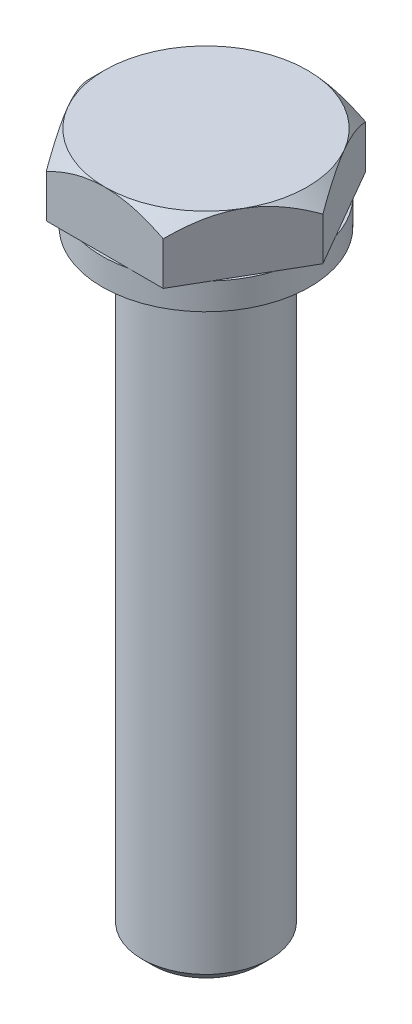
ISO-10303-21;
HEADER;
FILE_DESCRIPTION(('STEP AP214'),'2;1');
FILE_NAME('part.step','',(''),(''),'','','');
FILE_SCHEMA(('AUTOMOTIVE_DESIGN { 1 0 10303 214 1 1 1 1 }'));
ENDSEC;
DATA;
#1=APPLICATION_CONTEXT('core data for automotive mechanical design processes');
#2=APPLICATION_PROTOCOL_DEFINITION('international standard','automotive_design',2000,#1);
#3=PRODUCT_CONTEXT('',#1,'mechanical');
#4=PRODUCT('Part','Part','',(#3));
#5=PRODUCT_RELATED_PRODUCT_CATEGORY('part','',(#4));
#6=PRODUCT_DEFINITION_FORMATION('','',#4);
#7=PRODUCT_DEFINITION_CONTEXT('part definition',#1,'design');
#8=PRODUCT_DEFINITION('design','',#6,#7);
#9=PRODUCT_DEFINITION_SHAPE('','',#8);
#10=(LENGTH_UNIT() NAMED_UNIT(*) SI_UNIT(.MILLI.,.METRE.));
#11=(NAMED_UNIT(*) PLANE_ANGLE_UNIT() SI_UNIT($,.RADIAN.));
#12=(NAMED_UNIT(*) SI_UNIT($,.STERADIAN.) SOLID_ANGLE_UNIT());
#13=UNCERTAINTY_MEASURE_WITH_UNIT(LENGTH_MEASURE(1.E-05),#10,'distance_accuracy_value','');
#14=(GEOMETRIC_REPRESENTATION_CONTEXT(3) GLOBAL_UNCERTAINTY_ASSIGNED_CONTEXT((#13)) GLOBAL_UNIT_ASSIGNED_CONTEXT((#10,
#11,#12)) REPRESENTATION_CONTEXT('',''));
#15=CARTESIAN_POINT('',(0.,0.,0.));
#16=DIRECTION('',(0.,0.,1.));
#17=DIRECTION('',(1.,0.,0.));
#18=AXIS2_PLACEMENT_3D('',#15,#16,#17);
#19=CARTESIAN_POINT('',(0.,0.,0.));
#20=DIRECTION('',(0.,1.,0.));
#21=DIRECTION('',(0.,0.,1.));
#22=AXIS2_PLACEMENT_3D('',#19,#20,#21);
#23=PLANE('',#22);
#24=CARTESIAN_POINT('',(0.,0.,0.));
#25=DIRECTION('',(0.,1.,0.));
#26=DIRECTION('',(0.,0.,1.));
#27=AXIS2_PLACEMENT_3D('',#24,#25,#26);
#28=CIRCLE('',#27,6.);
#29=CARTESIAN_POINT('',(0.,0.,6.));
#30=VERTEX_POINT('',#29);
#31=EDGE_CURVE('E204',#30,#30,#28,.T.);
#32=ORIENTED_EDGE('',*,*,#31,.T.);
#33=EDGE_LOOP('',(#32));
#34=FACE_BOUND('',#33,.T.);
#35=CARTESIAN_POINT('',(0.,0.,0.));
#36=DIRECTION('',(0.,-1.,0.));
#37=DIRECTION('',(0.,0.,-1.));
#38=AXIS2_PLACEMENT_3D('',#35,#36,#37);
#39=CIRCLE('',#38,6.5);
#40=CARTESIAN_POINT('',(0.,0.,-6.5));
#41=VERTEX_POINT('',#40);
#42=EDGE_CURVE('E453',#41,#41,#39,.T.);
#43=ORIENTED_EDGE('',*,*,#42,.T.);
#44=EDGE_LOOP('',(#43));
#45=FACE_BOUND('',#44,.T.);
#46=ADVANCED_FACE('F41',(#34,#45),#23,.F.);
#47=CARTESIAN_POINT('',(0.,-60.,0.));
#48=DIRECTION('',(0.,1.,0.));
#49=DIRECTION('',(0.,0.,1.));
#50=AXIS2_PLACEMENT_3D('',#47,#48,#49);
#51=CYLINDRICAL_SURFACE('',#50,6.);
#52=CARTESIAN_POINT('',(0.,-59.,0.));
#53=DIRECTION('',(0.,1.,0.));
#54=DIRECTION('',(0.,0.,1.));
#55=AXIS2_PLACEMENT_3D('',#52,#53,#54);
#56=CIRCLE('',#55,6.);
#57=CARTESIAN_POINT('',(0.,-59.,6.));
#58=VERTEX_POINT('',#57);
#59=EDGE_CURVE('E192',#58,#58,#56,.T.);
#60=ORIENTED_EDGE('',*,*,#59,.T.);
#61=EDGE_LOOP('',(#60));
#62=FACE_BOUND('',#61,.T.);
#63=ORIENTED_EDGE('',*,*,#31,.F.);
#64=EDGE_LOOP('',(#63));
#65=FACE_BOUND('',#64,.T.);
#66=ADVANCED_FACE('F344',(#62,#65),#51,.T.);
#67=CARTESIAN_POINT('',(0.,-60.,0.));
#68=DIRECTION('',(0.,1.,0.));
#69=DIRECTION('',(0.,0.,1.));
#70=AXIS2_PLACEMENT_3D('',#67,#68,#69);
#71=PLANE('',#70);
#72=CARTESIAN_POINT('',(0.,-60.,0.));
#73=DIRECTION('',(0.,1.,0.));
#74=DIRECTION('',(0.,0.,1.));
#75=AXIS2_PLACEMENT_3D('',#72,#73,#74);
#76=CIRCLE('',#75,4.99999999999998);
#77=CARTESIAN_POINT('',(0.,-60.,4.99999999999998));
#78=VERTEX_POINT('',#77);
#79=EDGE_CURVE('E187',#78,#78,#76,.F.);
#80=ORIENTED_EDGE('',*,*,#79,.T.);
#81=EDGE_LOOP('',(#80));
#82=FACE_BOUND('',#81,.T.);
#83=ADVANCED_FACE('F349',(#82),#71,.F.);
#84=CARTESIAN_POINT('',(0.,-59.,0.));
#85=DIRECTION('',(0.,1.,0.));
#86=DIRECTION('',(0.,0.,1.));
#87=AXIS2_PLACEMENT_3D('',#84,#85,#86);
#88=CONICAL_SURFACE('',#87,6.,0.785398163397449);
#89=ORIENTED_EDGE('',*,*,#79,.F.);
#90=EDGE_LOOP('',(#89));
#91=FACE_BOUND('',#90,.T.);
#92=ORIENTED_EDGE('',*,*,#59,.F.);
#93=EDGE_LOOP('',(#92));
#94=FACE_BOUND('',#93,.T.);
#95=ADVANCED_FACE('F44',(#91,#94),#88,.T.);
#96=CARTESIAN_POINT('',(0.,0.,0.));
#97=DIRECTION('',(0.,-1.,0.));
#98=DIRECTION('',(0.,0.,-1.));
#99=AXIS2_PLACEMENT_3D('',#96,#97,#98);
#100=PLANE('',#99);
#101=CARTESIAN_POINT('',(0.,0.,0.));
#102=DIRECTION('',(0.,-1.,0.));
#103=DIRECTION('',(0.,0.,-1.));
#104=AXIS2_PLACEMENT_3D('',#101,#102,#103);
#105=CIRCLE('',#104,9.75);
#106=CARTESIAN_POINT('',(9.32411188437618,0.,2.85016448080369));
#107=VERTEX_POINT('',#106);
#108=CARTESIAN_POINT('',(7.13037078752817,0.,6.64983551919632));
#109=VERTEX_POINT('',#108);
#110=EDGE_CURVE('E179',#107,#109,#105,.T.);
#111=ORIENTED_EDGE('',*,*,#110,.F.);
#112=DIRECTION('',(0.5,0.,-0.866025403784439));
#113=VECTOR('',#112,1.);
#114=CARTESIAN_POINT('',(5.48482755730145,0.,9.5));
#115=LINE('',#114,#113);
#116=EDGE_CURVE('E254',#109,#107,#115,.T.);
#117=ORIENTED_EDGE('',*,*,#116,.F.);
#118=EDGE_LOOP('',(#111,#117));
#119=FACE_BOUND('',#118,.T.);
#120=ADVANCED_FACE('F472',(#119),#100,.F.);
#121=CARTESIAN_POINT('',(7.13037078752815,0.,-6.64983551919633));
#122=VERTEX_POINT('',#121);
#123=CARTESIAN_POINT('',(9.32411188437618,0.,-2.85016448080368));
#124=VERTEX_POINT('',#123);
#125=EDGE_CURVE('E438',#122,#124,#105,.T.);
#126=ORIENTED_EDGE('',*,*,#125,.F.);
#127=DIRECTION('',(-0.5,0.,-0.866025403784438));
#128=VECTOR('',#127,1.);
#129=CARTESIAN_POINT('',(10.9696551146029,0.,0.));
#130=LINE('',#129,#128);
#131=EDGE_CURVE('E251',#124,#122,#130,.T.);
#132=ORIENTED_EDGE('',*,*,#131,.F.);
#133=EDGE_LOOP('',(#126,#132));
#134=FACE_BOUND('',#133,.T.);
#135=ADVANCED_FACE('F474',(#134),#100,.F.);
#136=CARTESIAN_POINT('',(-2.19374109684802,0.,-9.5));
#137=VERTEX_POINT('',#136);
#138=CARTESIAN_POINT('',(2.19374109684802,0.,-9.5));
#139=VERTEX_POINT('',#138);
#140=EDGE_CURVE('E439',#137,#139,#105,.T.);
#141=ORIENTED_EDGE('',*,*,#140,.F.);
#142=DIRECTION('',(-1.,0.,0.));
#143=VECTOR('',#142,1.);
#144=CARTESIAN_POINT('',(5.48482755730144,0.,-9.5));
#145=LINE('',#144,#143);
#146=EDGE_CURVE('E246',#139,#137,#145,.T.);
#147=ORIENTED_EDGE('',*,*,#146,.F.);
#148=EDGE_LOOP('',(#141,#147));
#149=FACE_BOUND('',#148,.T.);
#150=ADVANCED_FACE('F480',(#149),#100,.F.);
#151=CARTESIAN_POINT('',(-9.32411188437618,0.,-2.85016448080367));
#152=VERTEX_POINT('',#151);
#153=CARTESIAN_POINT('',(-7.13037078752815,0.,-6.64983551919633));
#154=VERTEX_POINT('',#153);
#155=EDGE_CURVE('E445',#152,#154,#105,.T.);
#156=ORIENTED_EDGE('',*,*,#155,.F.);
#157=DIRECTION('',(-0.5,0.,0.866025403784439));
#158=VECTOR('',#157,1.);
#159=CARTESIAN_POINT('',(-5.48482755730144,0.,-9.5));
#160=LINE('',#159,#158);
#161=EDGE_CURVE('E240',#154,#152,#160,.T.);
#162=ORIENTED_EDGE('',*,*,#161,.F.);
#163=EDGE_LOOP('',(#156,#162));
#164=FACE_BOUND('',#163,.T.);
#165=ADVANCED_FACE('F488',(#164),#100,.F.);
#166=CARTESIAN_POINT('',(-7.13037078752814,0.,6.64983551919635));
#167=VERTEX_POINT('',#166);
#168=CARTESIAN_POINT('',(-9.32411188437619,0.,2.85016448080365));
#169=VERTEX_POINT('',#168);
#170=EDGE_CURVE('E180',#167,#169,#105,.T.);
#171=ORIENTED_EDGE('',*,*,#170,.F.);
#172=DIRECTION('',(0.5,0.,0.866025403784438));
#173=VECTOR('',#172,1.);
#174=CARTESIAN_POINT('',(-10.9696551146029,0.,0.));
#175=LINE('',#174,#173);
#176=EDGE_CURVE('E234',#169,#167,#175,.T.);
#177=ORIENTED_EDGE('',*,*,#176,.F.);
#178=EDGE_LOOP('',(#171,#177));
#179=FACE_BOUND('',#178,.T.);
#180=ADVANCED_FACE('F484',(#179),#100,.F.);
#181=CARTESIAN_POINT('',(2.19374109684805,0.,9.5));
#182=VERTEX_POINT('',#181);
#183=CARTESIAN_POINT('',(-2.19374109684805,0.,9.5));
#184=VERTEX_POINT('',#183);
#185=EDGE_CURVE('E175',#182,#184,#105,.T.);
#186=ORIENTED_EDGE('',*,*,#185,.F.);
#187=DIRECTION('',(1.,0.,0.));
#188=VECTOR('',#187,1.);
#189=CARTESIAN_POINT('',(-5.48482755730144,0.,9.5));
#190=LINE('',#189,#188);
#191=EDGE_CURVE('E152',#184,#182,#190,.T.);
#192=ORIENTED_EDGE('',*,*,#191,.F.);
#193=EDGE_LOOP('',(#186,#192));
#194=FACE_BOUND('',#193,.T.);
#195=ADVANCED_FACE('F176',(#194),#100,.F.);
#196=CARTESIAN_POINT('',(0.,-2.5,0.));
#197=DIRECTION('',(0.,-1.,0.));
#198=DIRECTION('',(0.,0.,-1.));
#199=AXIS2_PLACEMENT_3D('',#196,#197,#198);
#200=PLANE('',#199);
#201=CARTESIAN_POINT('',(0.,-2.5,0.));
#202=DIRECTION('',(0.,-1.,0.));
#203=DIRECTION('',(0.,0.,-1.));
#204=AXIS2_PLACEMENT_3D('',#201,#202,#203);
#205=CIRCLE('',#204,9.75);
#206=CARTESIAN_POINT('',(0.,-2.5,-9.75));
#207=VERTEX_POINT('',#206);
#208=EDGE_CURVE('E429',#207,#207,#205,.T.);
#209=ORIENTED_EDGE('',*,*,#208,.T.);
#210=EDGE_LOOP('',(#209));
#211=FACE_BOUND('',#210,.T.);
#212=CARTESIAN_POINT('',(0.,-2.5,0.));
#213=DIRECTION('',(0.,-1.,0.));
#214=DIRECTION('',(0.,0.,-1.));
#215=AXIS2_PLACEMENT_3D('',#212,#213,#214);
#216=CIRCLE('',#215,6.5);
#217=CARTESIAN_POINT('',(0.,-2.5,-6.5));
#218=VERTEX_POINT('',#217);
#219=EDGE_CURVE('E450',#218,#218,#216,.T.);
#220=ORIENTED_EDGE('',*,*,#219,.F.);
#221=EDGE_LOOP('',(#220));
#222=FACE_BOUND('',#221,.T.);
#223=ADVANCED_FACE('F467',(#211,#222),#200,.T.);
#224=CARTESIAN_POINT('',(0.,-2.5,0.));
#225=DIRECTION('',(0.,1.,0.));
#226=DIRECTION('',(0.,0.,1.));
#227=AXIS2_PLACEMENT_3D('',#224,#225,#226);
#228=CYLINDRICAL_SURFACE('',#227,9.75);
#229=ORIENTED_EDGE('',*,*,#208,.F.);
#230=EDGE_LOOP('',(#229));
#231=FACE_BOUND('',#230,.T.);
#232=EDGE_CURVE('E435',#139,#122,#105,.T.);
#233=ORIENTED_EDGE('',*,*,#232,.T.);
#234=ORIENTED_EDGE('',*,*,#125,.T.);
#235=CARTESIAN_POINT('',(0.,0.,0.));
#236=DIRECTION('',(0.,1.,0.));
#237=DIRECTION('',(0.,0.,1.));
#238=AXIS2_PLACEMENT_3D('',#235,#236,#237);
#239=CIRCLE('',#238,9.75);
#240=EDGE_CURVE('E67',#124,#107,#239,.F.);
#241=ORIENTED_EDGE('',*,*,#240,.T.);
#242=ORIENTED_EDGE('',*,*,#110,.T.);
#243=EDGE_CURVE('E46',#109,#182,#239,.F.);
#244=ORIENTED_EDGE('',*,*,#243,.T.);
#245=ORIENTED_EDGE('',*,*,#185,.T.);
#246=EDGE_CURVE('E11',#184,#167,#239,.F.);
#247=ORIENTED_EDGE('',*,*,#246,.T.);
#248=ORIENTED_EDGE('',*,*,#170,.T.);
#249=EDGE_CURVE('E52',#169,#152,#239,.F.);
#250=ORIENTED_EDGE('',*,*,#249,.T.);
#251=ORIENTED_EDGE('',*,*,#155,.T.);
#252=EDGE_CURVE('E190',#154,#137,#239,.F.);
#253=ORIENTED_EDGE('',*,*,#252,.T.);
#254=ORIENTED_EDGE('',*,*,#140,.T.);
#255=EDGE_LOOP('',(#233,#234,#241,#242,#244,#245,#247,#248,#250,#251,#253,#254));
#256=FACE_BOUND('',#255,.T.);
#257=ADVANCED_FACE('F184',(#231,#256),#228,.T.);
#258=CARTESIAN_POINT('',(0.,-2.5,0.));
#259=DIRECTION('',(0.,1.,0.));
#260=DIRECTION('',(0.,0.,1.));
#261=AXIS2_PLACEMENT_3D('',#258,#259,#260);
#262=CYLINDRICAL_SURFACE('',#261,6.5);
#263=ORIENTED_EDGE('',*,*,#219,.T.);
#264=EDGE_LOOP('',(#263));
#265=FACE_BOUND('',#264,.T.);
#266=ORIENTED_EDGE('',*,*,#42,.F.);
#267=EDGE_LOOP('',(#266));
#268=FACE_BOUND('',#267,.T.);
#269=ADVANCED_FACE('F459',(#265,#268),#262,.F.);
#270=CARTESIAN_POINT('',(0.,5.5,0.));
#271=DIRECTION('',(0.,1.,0.));
#272=DIRECTION('',(0.,0.,1.));
#273=AXIS2_PLACEMENT_3D('',#270,#271,#272);
#274=PLANE('',#273);
#275=CARTESIAN_POINT('',(0.,5.5,0.));
#276=DIRECTION('',(0.,1.,0.));
#277=DIRECTION('',(0.,0.,1.));
#278=AXIS2_PLACEMENT_3D('',#275,#276,#277);
#279=CIRCLE('',#278,9.5);
#280=CARTESIAN_POINT('',(-8.22724133595217,5.5,4.75));
#281=VERTEX_POINT('',#280);
#282=CARTESIAN_POINT('',(0.,5.5,9.5));
#283=VERTEX_POINT('',#282);
#284=EDGE_CURVE('E200',#281,#283,#279,.T.);
#285=ORIENTED_EDGE('',*,*,#284,.T.);
#286=CARTESIAN_POINT('',(0.,5.5,0.));
#287=DIRECTION('',(0.,1.,0.));
#288=DIRECTION('',(0.,0.,1.));
#289=AXIS2_PLACEMENT_3D('',#286,#287,#288);
#290=CIRCLE('',#289,9.5);
#291=CARTESIAN_POINT('',(8.22724133595217,5.5,4.75));
#292=VERTEX_POINT('',#291);
#293=EDGE_CURVE('E412',#283,#292,#290,.T.);
#294=ORIENTED_EDGE('',*,*,#293,.T.);
#295=CARTESIAN_POINT('',(8.22724133595217,5.5,-4.75000000000001));
#296=VERTEX_POINT('',#295);
#297=EDGE_CURVE('E197',#292,#296,#279,.T.);
#298=ORIENTED_EDGE('',*,*,#297,.T.);
#299=CARTESIAN_POINT('',(0.,5.5,-9.5));
#300=VERTEX_POINT('',#299);
#301=EDGE_CURVE('E401',#296,#300,#279,.T.);
#302=ORIENTED_EDGE('',*,*,#301,.T.);
#303=CARTESIAN_POINT('',(-8.22724133595217,5.5,-4.75));
#304=VERTEX_POINT('',#303);
#305=EDGE_CURVE('E399',#300,#304,#279,.T.);
#306=ORIENTED_EDGE('',*,*,#305,.T.);
#307=EDGE_CURVE('E203',#304,#281,#279,.T.);
#308=ORIENTED_EDGE('',*,*,#307,.T.);
#309=EDGE_LOOP('',(#285,#294,#298,#302,#306,#308));
#310=FACE_BOUND('',#309,.T.);
#311=ADVANCED_FACE('F287',(#310),#274,.T.);
#312=CARTESIAN_POINT('',(0.,5.5,0.));
#313=DIRECTION('',(0.,-1.,0.));
#314=DIRECTION('',(0.,0.,-1.));
#315=AXIS2_PLACEMENT_3D('',#312,#313,#314);
#316=CONICAL_SURFACE('',#315,9.5,0.785398163397448);
#317=CARTESIAN_POINT('',(5.48471208724761,4.03022941352008,9.5002));
#318=CARTESIAN_POINT('',(5.57900903100241,4.12451305275812,9.33687290241823));
#319=CARTESIAN_POINT('',(5.67404447275101,4.21591967907672,9.17226668878989));
#320=CARTESIAN_POINT('',(5.86570730642932,4.39206501429793,8.84029692293643));
#321=CARTESIAN_POINT('',(5.96233553343551,4.47680008162165,8.67293192431642));
#322=CARTESIAN_POINT('',(6.15775465782218,4.63904726595057,8.33445607210808));
#323=CARTESIAN_POINT('',(6.25655477026744,4.71651524790198,8.16332925755938));
#324=CARTESIAN_POINT('',(6.45577775543312,4.86254572212603,7.81826492521687));
#325=CARTESIAN_POINT('',(6.55620037740737,4.93110957593673,7.6443278417282));
#326=CARTESIAN_POINT('',(6.75705373920339,5.05716241426521,7.29643961422646));
#327=CARTESIAN_POINT('',(6.8574597962813,5.11480781409619,7.12253122197986));
#328=CARTESIAN_POINT('',(7.05967942874735,5.21916953089301,6.77227654426076));
#329=CARTESIAN_POINT('',(7.16149285135171,5.26588702447714,6.59593052341753));
#330=CARTESIAN_POINT('',(7.36609172761754,5.3472167639281,6.24155487455362));
#331=CARTESIAN_POINT('',(7.46887444897753,5.38185625756676,6.06352997901792));
#332=CARTESIAN_POINT('',(7.67530278601613,5.43826883773012,5.70598561114512));
#333=CARTESIAN_POINT('',(7.77894827040215,5.46004384690283,5.52646636621343));
#334=CARTESIAN_POINT('',(8.03152319659844,5.49655435673329,5.08899376132351));
#335=CARTESIAN_POINT('',(8.18072563612125,5.50421609749858,4.83056755545678));
#336=CARTESIAN_POINT('',(8.47886067593323,5.49135626172781,4.31418251898585));
#337=CARTESIAN_POINT('',(8.62779316331623,5.47082480615118,4.05622388394088));
#338=CARTESIAN_POINT('',(8.92425422695666,5.40279045892086,3.54273825924976));
#339=CARTESIAN_POINT('',(9.07178104546182,5.35525740747113,3.28721431411982));
#340=CARTESIAN_POINT('',(9.36429897995981,5.2358036134359,2.78055838944421));
#341=CARTESIAN_POINT('',(9.50929028950328,5.1638847409879,2.52942607465897));
#342=CARTESIAN_POINT('',(9.76666961157864,5.01592936852339,2.0836320120068));
#343=CARTESIAN_POINT('',(9.87962765862301,4.94378482539215,1.88798293540221));
#344=CARTESIAN_POINT('',(10.1035161311739,4.78787046820498,1.5001967257151));
#345=CARTESIAN_POINT('',(10.2144464952021,4.70410030232546,1.30805969911616));
#346=CARTESIAN_POINT('',(10.4339302023285,4.52681237218113,0.927902766939698));
#347=CARTESIAN_POINT('',(10.5424897875299,4.43332526303183,0.739872049722142));
#348=CARTESIAN_POINT('',(10.7575988522843,4.23783068526742,0.367292220399022));
#349=CARTESIAN_POINT('',(10.8641495158537,4.13582844079842,0.182741057516513));
#350=CARTESIAN_POINT('',(10.9697705846567,4.03022941352008,-0.000200000000001017));
#351=B_SPLINE_CURVE_WITH_KNOTS('',3,(#317,#318,#319,#320,#321,#322,#323,#324,#325,#326,#327,
#328,#329,#330,#331,#332,#333,#334,#335,#336,#337,#338,#339,#340,#341,#342,#343,#344,#345,#346,
#347,#348,#349,#350),.UNSPECIFIED.,.F.,.F.,(4,2,2,2,2,2,2,2,2,2,2,2,2,2,2,2,4),(0.,
0.63257206267041,1.26548704629925,1.9020259640234,2.53846743312796,3.16495668699838,
3.79137845508004,4.41637774062803,5.04128359391858,5.93539756360894,6.82982491537984,
7.72525327976969,8.62061298969156,9.33174689146321,10.0429023188133,10.7518786251228,
11.4604231176808),.UNSPECIFIED.);
#352=CARTESIAN_POINT('',(10.9696551146029,4.03034488539711,0.));
#353=VERTEX_POINT('',#352);
#354=EDGE_CURVE('E256',#292,#353,#351,.T.);
#355=ORIENTED_EDGE('',*,*,#354,.T.);
#356=CARTESIAN_POINT('',(10.9697705846567,4.03022941352008,0.000200000000000085));
#357=CARTESIAN_POINT('',(10.8754736409019,4.12451305275812,-0.163127097581767));
#358=CARTESIAN_POINT('',(10.7804381991533,4.21591967907672,-0.327733311210104));
#359=CARTESIAN_POINT('',(10.588775365475,4.39206501429793,-0.659703077063567));
#360=CARTESIAN_POINT('',(10.4921471384688,4.47680008162164,-0.827068075683574));
#361=CARTESIAN_POINT('',(10.2967280140822,4.63904726595057,-1.16554392789191));
#362=CARTESIAN_POINT('',(10.1979279016369,4.71651524790198,-1.33667074244062));
#363=CARTESIAN_POINT('',(9.99870491647122,4.86254572212603,-1.68173507478313));
#364=CARTESIAN_POINT('',(9.89828229449697,4.93110957593673,-1.85567215827181));
#365=CARTESIAN_POINT('',(9.69742893270094,5.05716241426521,-2.20356038577354));
#366=CARTESIAN_POINT('',(9.59702287562303,5.11480781409619,-2.37746877802014));
#367=CARTESIAN_POINT('',(9.39480324315698,5.21916953089301,-2.72772345573924));
#368=CARTESIAN_POINT('',(9.29298982055263,5.26588702447714,-2.90406947658247));
#369=CARTESIAN_POINT('',(9.0883909442868,5.3472167639281,-3.25844512544638));
#370=CARTESIAN_POINT('',(8.98560822292681,5.38185625756677,-3.43647002098208));
#371=CARTESIAN_POINT('',(8.77917988588821,5.43826883773012,-3.79401438885488));
#372=CARTESIAN_POINT('',(8.67553440150218,5.46004384690283,-3.97353363378657));
#373=CARTESIAN_POINT('',(8.4229594753059,5.4965543567333,-4.4110062386765));
#374=CARTESIAN_POINT('',(8.27375703578308,5.50421609749859,-4.66943244454323));
#375=CARTESIAN_POINT('',(7.9756219959711,5.49135626172781,-5.18581748101415));
#376=CARTESIAN_POINT('',(7.8266895085881,5.47082480615119,-5.44377611605912));
#377=CARTESIAN_POINT('',(7.53022844494767,5.40279045892086,-5.95726174075025));
#378=CARTESIAN_POINT('',(7.38270162644251,5.35525740747113,-6.21278568588018));
#379=CARTESIAN_POINT('',(7.09018369194453,5.2358036134359,-6.7194416105558));
#380=CARTESIAN_POINT('',(6.94519238240105,5.1638847409879,-6.97057392534104));
#381=CARTESIAN_POINT('',(6.68781306032569,5.01592936852339,-7.4163679879932));
#382=CARTESIAN_POINT('',(6.57485501328133,4.94378482539215,-7.61201706459779));
#383=CARTESIAN_POINT('',(6.35096654073045,4.78787046820498,-7.99980327428491));
#384=CARTESIAN_POINT('',(6.24003617670226,4.70410030232547,-8.19194030088384));
#385=CARTESIAN_POINT('',(6.02055246957587,4.52681237218114,-8.5720972330603));
#386=CARTESIAN_POINT('',(5.9119928843744,4.43332526303183,-8.76012795027786));
#387=CARTESIAN_POINT('',(5.69688381962007,4.23783068526743,-9.13270777960098));
#388=CARTESIAN_POINT('',(5.5903331560506,4.13582844079842,-9.31725894248349));
#389=CARTESIAN_POINT('',(5.4847120872476,4.03022941352008,-9.5002));
#390=B_SPLINE_CURVE_WITH_KNOTS('',3,(#356,#357,#358,#359,#360,#361,#362,#363,#364,#365,#366,
#367,#368,#369,#370,#371,#372,#373,#374,#375,#376,#377,#378,#379,#380,#381,#382,#383,#384,#385,
#386,#387,#388,#389),.UNSPECIFIED.,.F.,.F.,(4,2,2,2,2,2,2,2,2,2,2,2,2,2,2,2,4),(0.,
0.632572062670412,1.26548704629925,1.90202596402341,2.53846743312797,3.16495668699839,
3.79137845508005,4.41637774062804,5.0412835939186,5.93539756360895,6.82982491537985,
7.72525327976971,8.62061298969157,9.33174689146323,10.0429023188133,10.7518786251229,
11.4604231176808),.UNSPECIFIED.);
#391=EDGE_CURVE('E266',#353,#296,#390,.T.);
#392=ORIENTED_EDGE('',*,*,#391,.T.);
#393=ORIENTED_EDGE('',*,*,#297,.F.);
#394=EDGE_LOOP('',(#355,#392,#393));
#395=FACE_BOUND('',#394,.T.);
#396=ADVANCED_FACE('F285',(#395),#316,.T.);
#397=CARTESIAN_POINT('',(5.48482755730145,4.03034488539711,-9.5));
#398=VERTEX_POINT('',#397);
#399=EDGE_CURVE('E267',#296,#398,#390,.T.);
#400=ORIENTED_EDGE('',*,*,#399,.T.);
#401=CARTESIAN_POINT('',(16.5526930513978,-4.08511585644147,-9.5));
#402=CARTESIAN_POINT('',(16.3078975093556,-3.87281064033944,-9.5));
#403=CARTESIAN_POINT('',(16.0625313530003,-3.66116146645664,-9.5));
#404=CARTESIAN_POINT('',(15.5705039782896,-3.23936595886109,-9.5));
#405=CARTESIAN_POINT('',(15.3238427385609,-3.02921965008696,-9.5));
#406=CARTESIAN_POINT('',(14.8289626137527,-2.61052881441162,-9.5));
#407=CARTESIAN_POINT('',(14.5807430479804,-2.40198509096151,-9.5));
#408=CARTESIAN_POINT('',(14.0826815219023,-1.98684897000587,-9.5));
#409=CARTESIAN_POINT('',(13.8328395672994,-1.78025656564741,-9.5));
#410=CARTESIAN_POINT('',(13.0690339736071,-1.15434157818636,-9.5));
#411=CARTESIAN_POINT('',(12.5521592758855,-0.738542800162536,-9.5));
#412=CARTESIAN_POINT('',(11.7695040497769,-0.124327504116688,-9.5));
#413=CARTESIAN_POINT('',(11.507423703153,0.0788091039046497,-9.5));
#414=CARTESIAN_POINT('',(10.9804259452721,0.481364439199906,-9.5));
#415=CARTESIAN_POINT('',(10.7155085937285,0.680783244485111,-9.5));
#416=CARTESIAN_POINT('',(10.182049087553,1.07549325818297,-9.5));
#417=CARTESIAN_POINT('',(9.91350246392285,1.27077843710951,-9.5));
#418=CARTESIAN_POINT('',(9.37263900317949,1.65607522397668,-9.5));
#419=CARTESIAN_POINT('',(9.10032212381803,1.84608677275087,-9.5));
#420=CARTESIAN_POINT('',(8.5511040508471,2.21990378369879,-9.5));
#421=CARTESIAN_POINT('',(8.27419909438331,2.40370373356655,-9.5));
#422=CARTESIAN_POINT('',(7.71537207132478,2.7635278733879,-9.5));
#423=CARTESIAN_POINT('',(7.43345011396875,2.939552232355,-9.5));
#424=CARTESIAN_POINT('',(6.86601677310837,3.28073476767734,-9.5));
#425=CARTESIAN_POINT('',(6.58054944164094,3.44596586624554,-9.5));
#426=CARTESIAN_POINT('',(6.00311604351526,3.76481218488239,-9.5));
#427=CARTESIAN_POINT('',(5.71114919950853,3.91842600574613,-9.5));
#428=CARTESIAN_POINT('',(5.12043515567325,4.21097227681983,-9.5));
#429=CARTESIAN_POINT('',(4.8216986951507,4.34992623962902,-9.5));
#430=CARTESIAN_POINT('',(4.21657051360468,4.60986676858188,-9.5));
#431=CARTESIAN_POINT('',(3.91018182234153,4.73086031809269,-9.5));
#432=CARTESIAN_POINT('',(3.28232408499689,4.95333057796222,-9.5));
#433=CARTESIAN_POINT('',(2.96067021723213,5.05429302050932,-9.5));
#434=CARTESIAN_POINT('',(2.30981414137871,5.22825264789689,-9.5));
#435=CARTESIAN_POINT('',(1.98061314702205,5.30125429642786,-9.5));
#436=CARTESIAN_POINT('',(1.31859709228853,5.41443128902268,-9.5));
#437=CARTESIAN_POINT('',(0.985816892761966,5.45480651597028,-9.5));
#438=CARTESIAN_POINT('',(0.317839349931747,5.50052179933779,-9.5));
#439=CARTESIAN_POINT('',(-0.0173577358812772,5.50586553431007,-9.5));
#440=CARTESIAN_POINT('',(-0.686846353851571,5.4810888627539,-9.5));
#441=CARTESIAN_POINT('',(-1.02113613756876,5.45092224928178,-9.5));
#442=CARTESIAN_POINT('',(-1.68499248709887,5.3573312936306,-9.5));
#443=CARTESIAN_POINT('',(-2.01455810978228,5.29390040302652,-9.5));
#444=CARTESIAN_POINT('',(-2.66891687175004,5.13737631327669,-9.5));
#445=CARTESIAN_POINT('',(-2.99365954142614,5.04407579579886,-9.5));
#446=CARTESIAN_POINT('',(-3.63491027073979,4.83285441566069,-9.5));
#447=CARTESIAN_POINT('',(-3.95141823945259,4.71493328127758,-9.5));
#448=CARTESIAN_POINT('',(-4.6466341624565,4.43027536615136,-9.5));
#449=CARTESIAN_POINT('',(-5.02327276275549,4.2585270273701,-9.5));
#450=CARTESIAN_POINT('',(-5.7653347821525,3.89212395071921,-9.5));
#451=CARTESIAN_POINT('',(-6.1307515640984,3.69745597391214,-9.5));
#452=CARTESIAN_POINT('',(-6.8524378145585,3.29030367022418,-9.5));
#453=CARTESIAN_POINT('',(-7.20868676254941,3.07778326602305,-9.5));
#454=CARTESIAN_POINT('',(-7.91270456069234,2.63937350012648,-9.5));
#455=CARTESIAN_POINT('',(-8.2604750827682,2.41348680483684,-9.5));
#456=CARTESIAN_POINT('',(-8.95081024134317,1.95004813016442,-9.5));
#457=CARTESIAN_POINT('',(-9.29333730920916,1.71244045281005,-9.5));
#458=CARTESIAN_POINT('',(-9.97246197776837,1.22890063426429,-9.5));
#459=CARTESIAN_POINT('',(-10.3090593500125,0.98296817341175,-9.5));
#460=CARTESIAN_POINT('',(-10.9768951226687,0.48473683286721,-9.5));
#461=CARTESIAN_POINT('',(-11.3081392193624,0.232445567484202,-9.5));
#462=CARTESIAN_POINT('',(-11.9664417550188,-0.277513707377575,-9.5));
#463=CARTESIAN_POINT('',(-12.2935002853568,-0.535181599154791,-9.5));
#464=CARTESIAN_POINT('',(-12.9544953754966,-1.063255797732,-9.5));
#465=CARTESIAN_POINT('',(-13.2883169283815,-1.33380582954674,-9.5));
#466=CARTESIAN_POINT('',(-13.9528282313241,-1.87884220734663,-9.5));
#467=CARTESIAN_POINT('',(-14.2835173997889,-2.15332926142478,-9.5));
#468=CARTESIAN_POINT('',(-14.9386114943959,-2.7025571077114,-9.5));
#469=CARTESIAN_POINT('',(-15.263045701968,-2.97726302318607,-9.5));
#470=CARTESIAN_POINT('',(-15.9095411921518,-3.52931410408089,-9.5));
#471=CARTESIAN_POINT('',(-16.2316029704651,-3.80665868872229,-9.5));
#472=CARTESIAN_POINT('',(-16.5526930513978,-4.08511585644147,-9.5));
#473=B_SPLINE_CURVE_WITH_KNOTS('',3,(#401,#402,#403,#404,#405,#406,#407,#408,#409,#410,#411,
#412,#413,#414,#415,#416,#417,#418,#419,#420,#421,#422,#423,#424,#425,#426,#427,#428,#429,#430,
#431,#432,#433,#434,#435,#436,#437,#438,#439,#440,#441,#442,#443,#444,#445,#446,#447,#448,#449,
#450,#451,#452,#453,#454,#455,#456,#457,#458,#459,#460,#461,#462,#463,#464,#465,#466,#467,#468,
#469,#470,#471,#472),.UNSPECIFIED.,.F.,.F.,(4,2,2,2,2,2,2,2,2,2,2,2,2,2,2,2,2,2,2,2,2,2,2,2,2,2,
2,2,2,2,2,2,2,2,2,4),(0.,0.972104021223937,1.94422413634167,2.91680341227861,3.88937927130256,
5.87928506457271,6.87402393691984,7.86874191294628,8.86482273543619,9.86091472873959,
10.8578686266059,11.8548008435885,12.8440946573635,13.8335074342521,14.8214474889508,
15.8090024009623,16.8193251954059,17.8294866335669,18.8334114623053,19.8372308702065,
20.8423579179451,21.8476829099005,22.8601426855627,23.8726136357182,25.1134086182597,
26.3549238630854,27.5990113514737,28.8428514914161,30.0933131313489,31.3438228420174,
32.592900297553,33.8419504377376,35.1309875899323,36.4202595637108,37.6955823580867,
38.9706306612628),.UNSPECIFIED.);
#474=EDGE_CURVE('E323',#398,#300,#473,.T.);
#475=ORIENTED_EDGE('',*,*,#474,.T.);
#476=ORIENTED_EDGE('',*,*,#301,.F.);
#477=EDGE_LOOP('',(#400,#475,#476));
#478=FACE_BOUND('',#477,.T.);
#479=ADVANCED_FACE('F369',(#478),#316,.T.);
#480=CARTESIAN_POINT('',(-5.48482755730144,4.03034488539711,-9.50000000000001));
#481=VERTEX_POINT('',#480);
#482=EDGE_CURVE('E316',#300,#481,#473,.T.);
#483=ORIENTED_EDGE('',*,*,#482,.T.);
#484=CARTESIAN_POINT('',(-5.48471208724761,4.03022941352008,-9.5002));
#485=CARTESIAN_POINT('',(-5.5790090310024,4.12451305275812,-9.33687290241824));
#486=CARTESIAN_POINT('',(-5.674044472751,4.21591967907672,-9.1722666887899));
#487=CARTESIAN_POINT('',(-5.86570730642932,4.39206501429793,-8.84029692293644));
#488=CARTESIAN_POINT('',(-5.9623355334355,4.47680008162165,-8.67293192431643));
#489=CARTESIAN_POINT('',(-6.15775465782217,4.63904726595057,-8.33445607210809));
#490=CARTESIAN_POINT('',(-6.25655477026743,4.71651524790198,-8.16332925755938));
#491=CARTESIAN_POINT('',(-6.45577775543312,4.86254572212603,-7.81826492521687));
#492=CARTESIAN_POINT('',(-6.55620037740736,4.93110957593673,-7.6443278417282));
#493=CARTESIAN_POINT('',(-6.75705373920339,5.05716241426521,-7.29643961422647));
#494=CARTESIAN_POINT('',(-6.8574597962813,5.11480781409619,-7.12253122197987));
#495=CARTESIAN_POINT('',(-7.05967942874735,5.21916953089301,-6.77227654426077));
#496=CARTESIAN_POINT('',(-7.16149285135171,5.26588702447714,-6.59593052341754));
#497=CARTESIAN_POINT('',(-7.36609172761754,5.3472167639281,-6.24155487455362));
#498=CARTESIAN_POINT('',(-7.46887444897753,5.38185625756677,-6.06352997901792));
#499=CARTESIAN_POINT('',(-7.67530278601612,5.43826883773012,-5.70598561114512));
#500=CARTESIAN_POINT('',(-7.77894827040215,5.46004384690283,-5.52646636621343));
#501=CARTESIAN_POINT('',(-8.03152319659843,5.4965543567333,-5.08899376132351));
#502=CARTESIAN_POINT('',(-8.18072563612125,5.50421609749859,-4.83056755545678));
#503=CARTESIAN_POINT('',(-8.47886067593323,5.49135626172781,-4.31418251898585));
#504=CARTESIAN_POINT('',(-8.62779316331623,5.47082480615119,-4.05622388394089));
#505=CARTESIAN_POINT('',(-8.92425422695665,5.40279045892086,-3.54273825924976));
#506=CARTESIAN_POINT('',(-9.07178104546182,5.35525740747113,-3.28721431411983));
#507=CARTESIAN_POINT('',(-9.3642989799598,5.2358036134359,-2.78055838944421));
#508=CARTESIAN_POINT('',(-9.50929028950327,5.16388474098791,-2.52942607465897));
#509=CARTESIAN_POINT('',(-9.76666961157864,5.01592936852339,-2.08363201200681));
#510=CARTESIAN_POINT('',(-9.879627658623,4.94378482539215,-1.88798293540222));
#511=CARTESIAN_POINT('',(-10.1035161311739,4.78787046820498,-1.5001967257151));
#512=CARTESIAN_POINT('',(-10.2144464952021,4.70410030232547,-1.30805969911617));
#513=CARTESIAN_POINT('',(-10.4339302023285,4.52681237218114,-0.927902766939701));
#514=CARTESIAN_POINT('',(-10.5424897875299,4.43332526303184,-0.739872049722146));
#515=CARTESIAN_POINT('',(-10.7575988522843,4.23783068526743,-0.367292220399026));
#516=CARTESIAN_POINT('',(-10.8641495158537,4.13582844079842,-0.182741057516517));
#517=CARTESIAN_POINT('',(-10.9697705846567,4.03022941352008,0.000199999999996115));
#518=B_SPLINE_CURVE_WITH_KNOTS('',3,(#484,#485,#486,#487,#488,#489,#490,#491,#492,#493,#494,
#495,#496,#497,#498,#499,#500,#501,#502,#503,#504,#505,#506,#507,#508,#509,#510,#511,#512,#513,
#514,#515,#516,#517),.UNSPECIFIED.,.F.,.F.,(4,2,2,2,2,2,2,2,2,2,2,2,2,2,2,2,4),(0.,
0.632572062670412,1.26548704629925,1.90202596402341,2.53846743312796,3.16495668699838,
3.79137845508004,4.41637774062803,5.04128359391859,5.93539756360894,6.82982491537984,
7.72525327976969,8.62061298969156,9.33174689146322,10.0429023188133,10.7518786251228,
11.4604231176808),.UNSPECIFIED.);
#519=EDGE_CURVE('E324',#481,#304,#518,.T.);
#520=ORIENTED_EDGE('',*,*,#519,.T.);
#521=ORIENTED_EDGE('',*,*,#305,.F.);
#522=EDGE_LOOP('',(#483,#520,#521));
#523=FACE_BOUND('',#522,.T.);
#524=ADVANCED_FACE('F364',(#523),#316,.T.);
#525=CARTESIAN_POINT('',(-10.9696551146029,4.03034488539711,0.));
#526=VERTEX_POINT('',#525);
#527=EDGE_CURVE('E310',#304,#526,#518,.T.);
#528=ORIENTED_EDGE('',*,*,#527,.T.);
#529=CARTESIAN_POINT('',(-10.9697705846567,4.03022941352008,-0.000200000000003556));
#530=CARTESIAN_POINT('',(-10.8754736409019,4.12451305275812,0.163127097581764));
#531=CARTESIAN_POINT('',(-10.7804381991533,4.21591967907672,0.3277333112101));
#532=CARTESIAN_POINT('',(-10.588775365475,4.39206501429793,0.659703077063562));
#533=CARTESIAN_POINT('',(-10.4921471384688,4.47680008162165,0.82706807568357));
#534=CARTESIAN_POINT('',(-10.2967280140822,4.63904726595057,1.16554392789191));
#535=CARTESIAN_POINT('',(-10.1979279016369,4.71651524790199,1.33667074244062));
#536=CARTESIAN_POINT('',(-9.99870491647121,4.86254572212603,1.68173507478313));
#537=CARTESIAN_POINT('',(-9.89828229449697,4.93110957593673,1.8556721582718));
#538=CARTESIAN_POINT('',(-9.69742893270094,5.05716241426521,2.20356038577353));
#539=CARTESIAN_POINT('',(-9.59702287562303,5.11480781409619,2.37746877802013));
#540=CARTESIAN_POINT('',(-9.39480324315698,5.21916953089301,2.72772345573923));
#541=CARTESIAN_POINT('',(-9.29298982055262,5.26588702447715,2.90406947658246));
#542=CARTESIAN_POINT('',(-9.08839094428679,5.3472167639281,3.25844512544638));
#543=CARTESIAN_POINT('',(-8.9856082229268,5.38185625756677,3.43647002098208));
#544=CARTESIAN_POINT('',(-8.77917988588821,5.43826883773013,3.79401438885488));
#545=CARTESIAN_POINT('',(-8.67553440150218,5.46004384690283,3.97353363378657));
#546=CARTESIAN_POINT('',(-8.4229594753059,5.4965543567333,4.41100623867649));
#547=CARTESIAN_POINT('',(-8.27375703578308,5.50421609749859,4.66943244454322));
#548=CARTESIAN_POINT('',(-7.9756219959711,5.49135626172781,5.18581748101415));
#549=CARTESIAN_POINT('',(-7.8266895085881,5.47082480615119,5.44377611605912));
#550=CARTESIAN_POINT('',(-7.53022844494767,5.40279045892087,5.95726174075024));
#551=CARTESIAN_POINT('',(-7.38270162644251,5.35525740747114,6.21278568588018));
#552=CARTESIAN_POINT('',(-7.09018369194453,5.2358036134359,6.71944161055579));
#553=CARTESIAN_POINT('',(-6.94519238240105,5.16388474098791,6.97057392534103));
#554=CARTESIAN_POINT('',(-6.68781306032569,5.01592936852339,7.4163679879932));
#555=CARTESIAN_POINT('',(-6.57485501328133,4.94378482539216,7.61201706459778));
#556=CARTESIAN_POINT('',(-6.35096654073045,4.78787046820498,7.9998032742849));
#557=CARTESIAN_POINT('',(-6.24003617670226,4.70410030232547,8.19194030088383));
#558=CARTESIAN_POINT('',(-6.02055246957587,4.52681237218114,8.5720972330603));
#559=CARTESIAN_POINT('',(-5.9119928843744,4.43332526303184,8.76012795027785));
#560=CARTESIAN_POINT('',(-5.69688381962007,4.23783068526743,9.13270777960097));
#561=CARTESIAN_POINT('',(-5.5903331560506,4.13582844079843,9.31725894248348));
#562=CARTESIAN_POINT('',(-5.4847120872476,4.03022941352009,9.5002));
#563=B_SPLINE_CURVE_WITH_KNOTS('',3,(#529,#530,#531,#532,#533,#534,#535,#536,#537,#538,#539,
#540,#541,#542,#543,#544,#545,#546,#547,#548,#549,#550,#551,#552,#553,#554,#555,#556,#557,#558,
#559,#560,#561,#562),.UNSPECIFIED.,.F.,.F.,(4,2,2,2,2,2,2,2,2,2,2,2,2,2,2,2,4),(0.,
0.632572062670411,1.26548704629925,1.90202596402341,2.53846743312796,3.16495668699838,
3.79137845508004,4.41637774062803,5.04128359391859,5.93539756360895,6.82982491537985,
7.7252532797697,8.62061298969156,9.33174689146322,10.0429023188133,10.7518786251229,
11.4604231176808),.UNSPECIFIED.);
#564=EDGE_CURVE('E374',#526,#281,#563,.T.);
#565=ORIENTED_EDGE('',*,*,#564,.T.);
#566=ORIENTED_EDGE('',*,*,#307,.F.);
#567=EDGE_LOOP('',(#528,#565,#566));
#568=FACE_BOUND('',#567,.T.);
#569=ADVANCED_FACE('F283',(#568),#316,.T.);
#570=CARTESIAN_POINT('',(5.48482755730146,4.03034488539711,9.5));
#571=VERTEX_POINT('',#570);
#572=EDGE_CURVE('E265',#571,#292,#351,.T.);
#573=ORIENTED_EDGE('',*,*,#572,.T.);
#574=ORIENTED_EDGE('',*,*,#293,.F.);
#575=CARTESIAN_POINT('',(-16.5526930513978,-4.08511585644147,9.5));
#576=CARTESIAN_POINT('',(-16.3078975093556,-3.87281064033944,9.5));
#577=CARTESIAN_POINT('',(-16.0625313530003,-3.66116146645664,9.5));
#578=CARTESIAN_POINT('',(-15.5705039782896,-3.23936595886109,9.5));
#579=CARTESIAN_POINT('',(-15.3238427385609,-3.02921965008696,9.5));
#580=CARTESIAN_POINT('',(-14.8289626137527,-2.61052881441162,9.5));
#581=CARTESIAN_POINT('',(-14.5807430479804,-2.40198509096151,9.5));
#582=CARTESIAN_POINT('',(-14.0826815219023,-1.98684897000587,9.5));
#583=CARTESIAN_POINT('',(-13.8328395672994,-1.78025656564741,9.5));
#584=CARTESIAN_POINT('',(-13.0690339736071,-1.15434157818636,9.5));
#585=CARTESIAN_POINT('',(-12.5521592758855,-0.738542800162536,9.5));
#586=CARTESIAN_POINT('',(-11.7695040497769,-0.124327504116687,9.5));
#587=CARTESIAN_POINT('',(-11.507423703153,0.0788091039046507,9.5));
#588=CARTESIAN_POINT('',(-10.9804259452721,0.481364439199906,9.5));
#589=CARTESIAN_POINT('',(-10.7155085937285,0.68078324448511,9.5));
#590=CARTESIAN_POINT('',(-10.182049087553,1.07549325818296,9.5));
#591=CARTESIAN_POINT('',(-9.91350246392286,1.27077843710951,9.5));
#592=CARTESIAN_POINT('',(-9.3726390031795,1.65607522397668,9.5));
#593=CARTESIAN_POINT('',(-9.10032212381804,1.84608677275087,9.5));
#594=CARTESIAN_POINT('',(-8.55110405084711,2.21990378369879,9.5));
#595=CARTESIAN_POINT('',(-8.27419909438331,2.40370373356655,9.5));
#596=CARTESIAN_POINT('',(-7.71537207132479,2.7635278733879,9.5));
#597=CARTESIAN_POINT('',(-7.43345011396876,2.939552232355,9.5));
#598=CARTESIAN_POINT('',(-6.86601677310838,3.28073476767734,9.5));
#599=CARTESIAN_POINT('',(-6.58054944164094,3.44596586624554,9.5));
#600=CARTESIAN_POINT('',(-6.00311604351527,3.76481218488239,9.5));
#601=CARTESIAN_POINT('',(-5.71114919950854,3.91842600574613,9.5));
#602=CARTESIAN_POINT('',(-5.12043515567326,4.21097227681983,9.5));
#603=CARTESIAN_POINT('',(-4.82169869515071,4.34992623962902,9.5));
#604=CARTESIAN_POINT('',(-4.21657051360469,4.60986676858188,9.5));
#605=CARTESIAN_POINT('',(-3.91018182234154,4.73086031809269,9.5));
#606=CARTESIAN_POINT('',(-3.2823240849969,4.95333057796222,9.5));
#607=CARTESIAN_POINT('',(-2.96067021723214,5.05429302050932,9.5));
#608=CARTESIAN_POINT('',(-2.30981414137872,5.2282526478969,9.5));
#609=CARTESIAN_POINT('',(-1.98061314702206,5.30125429642786,9.5));
#610=CARTESIAN_POINT('',(-1.31859709228854,5.41443128902269,9.5));
#611=CARTESIAN_POINT('',(-0.985816892761975,5.45480651597028,9.5));
#612=CARTESIAN_POINT('',(-0.317839349931756,5.5005217993378,9.5));
#613=CARTESIAN_POINT('',(0.0173577358812691,5.50586553431008,9.5));
#614=CARTESIAN_POINT('',(0.686846353851564,5.4810888627539,9.5));
#615=CARTESIAN_POINT('',(1.02113613756876,5.45092224928178,9.5));
#616=CARTESIAN_POINT('',(1.68499248709886,5.3573312936306,9.5));
#617=CARTESIAN_POINT('',(2.01455810978228,5.29390040302653,9.5));
#618=CARTESIAN_POINT('',(2.66891687175003,5.13737631327669,9.5));
#619=CARTESIAN_POINT('',(2.99365954142614,5.04407579579887,9.5));
#620=CARTESIAN_POINT('',(3.63491027073979,4.83285441566069,9.5));
#621=CARTESIAN_POINT('',(3.95141823945259,4.71493328127758,9.5));
#622=CARTESIAN_POINT('',(4.6466341624565,4.43027536615137,9.5));
#623=CARTESIAN_POINT('',(5.02327276275549,4.25852702737011,9.5));
#624=CARTESIAN_POINT('',(5.76533478215249,3.89212395071922,9.5));
#625=CARTESIAN_POINT('',(6.13075156409839,3.69745597391215,9.5));
#626=CARTESIAN_POINT('',(6.8524378145585,3.29030367022419,9.5));
#627=CARTESIAN_POINT('',(7.20868676254941,3.07778326602306,9.5));
#628=CARTESIAN_POINT('',(7.91270456069233,2.63937350012649,9.5));
#629=CARTESIAN_POINT('',(8.2604750827682,2.41348680483685,9.5));
#630=CARTESIAN_POINT('',(8.95081024134316,1.95004813016443,9.5));
#631=CARTESIAN_POINT('',(9.29333730920915,1.71244045281006,9.5));
#632=CARTESIAN_POINT('',(9.97246197776836,1.2289006342643,9.5));
#633=CARTESIAN_POINT('',(10.3090593500125,0.982968173411762,9.5));
#634=CARTESIAN_POINT('',(10.9768951226687,0.484736832867221,9.5));
#635=CARTESIAN_POINT('',(11.3081392193624,0.232445567484212,9.5));
#636=CARTESIAN_POINT('',(11.9664417550188,-0.277513707377565,9.5));
#637=CARTESIAN_POINT('',(12.2935002853568,-0.535181599154779,9.5));
#638=CARTESIAN_POINT('',(12.9544953754966,-1.06325579773199,9.5));
#639=CARTESIAN_POINT('',(13.2883169283815,-1.33380582954673,9.5));
#640=CARTESIAN_POINT('',(13.9528282313241,-1.87884220734662,9.5));
#641=CARTESIAN_POINT('',(14.2835173997889,-2.15332926142478,9.5));
#642=CARTESIAN_POINT('',(14.9386114943959,-2.7025571077114,9.5));
#643=CARTESIAN_POINT('',(15.263045701968,-2.97726302318607,9.5));
#644=CARTESIAN_POINT('',(15.9095411921518,-3.52931410408089,9.5));
#645=CARTESIAN_POINT('',(16.2316029704651,-3.80665868872229,9.5));
#646=CARTESIAN_POINT('',(16.5526930513978,-4.08511585644148,9.5));
#647=B_SPLINE_CURVE_WITH_KNOTS('',3,(#575,#576,#577,#578,#579,#580,#581,#582,#583,#584,#585,
#586,#587,#588,#589,#590,#591,#592,#593,#594,#595,#596,#597,#598,#599,#600,#601,#602,#603,#604,
#605,#606,#607,#608,#609,#610,#611,#612,#613,#614,#615,#616,#617,#618,#619,#620,#621,#622,#623,
#624,#625,#626,#627,#628,#629,#630,#631,#632,#633,#634,#635,#636,#637,#638,#639,#640,#641,#642,
#643,#644,#645,#646),.UNSPECIFIED.,.F.,.F.,(4,2,2,2,2,2,2,2,2,2,2,2,2,2,2,2,2,2,2,2,2,2,2,2,2,2,
2,2,2,2,2,2,2,2,2,4),(0.,0.972104021223938,1.94422413634167,2.91680341227861,3.88937927130256,
5.87928506457271,6.87402393691985,7.86874191294628,8.86482273543619,9.86091472873959,
10.8578686266059,11.8548008435885,12.8440946573635,13.833507434252,14.8214474889508,
15.8090024009623,16.8193251954059,17.8294866335669,18.8334114623053,19.8372308702065,
20.8423579179451,21.8476829099005,22.8601426855627,23.8726136357182,25.1134086182597,
26.3549238630854,27.5990113514736,28.842851491416,30.0933131313489,31.3438228420173,
32.592900297553,33.8419504377376,35.1309875899323,36.4202595637108,37.6955823580867,
38.9706306612628),.UNSPECIFIED.);
#648=EDGE_CURVE('E292',#283,#571,#647,.T.);
#649=ORIENTED_EDGE('',*,*,#648,.T.);
#650=EDGE_LOOP('',(#573,#574,#649));
#651=FACE_BOUND('',#650,.T.);
#652=ADVANCED_FACE('F277',(#651),#316,.T.);
#653=CARTESIAN_POINT('',(-5.48482755730146,4.03034488539711,9.5));
#654=VERTEX_POINT('',#653);
#655=EDGE_CURVE('E302',#281,#654,#563,.T.);
#656=ORIENTED_EDGE('',*,*,#655,.T.);
#657=EDGE_CURVE('E424',#654,#283,#647,.T.);
#658=ORIENTED_EDGE('',*,*,#657,.T.);
#659=ORIENTED_EDGE('',*,*,#284,.F.);
#660=EDGE_LOOP('',(#656,#658,#659));
#661=FACE_BOUND('',#660,.T.);
#662=ADVANCED_FACE('F282',(#661),#316,.T.);
#663=ORIENTED_EDGE('',*,*,#243,.F.);
#664=CARTESIAN_POINT('',(5.48482755730145,0.,9.5));
#665=VERTEX_POINT('',#664);
#666=EDGE_CURVE('E172',#665,#109,#115,.T.);
#667=ORIENTED_EDGE('',*,*,#666,.F.);
#668=EDGE_CURVE('E157',#182,#665,#190,.T.);
#669=ORIENTED_EDGE('',*,*,#668,.F.);
#670=EDGE_LOOP('',(#663,#667,#669));
#671=FACE_BOUND('',#670,.T.);
#672=ADVANCED_FACE('F169',(#671),#23,.F.);
#673=ORIENTED_EDGE('',*,*,#246,.F.);
#674=CARTESIAN_POINT('',(-5.48482755730144,0.,9.5));
#675=VERTEX_POINT('',#674);
#676=EDGE_CURVE('E161',#675,#184,#190,.T.);
#677=ORIENTED_EDGE('',*,*,#676,.F.);
#678=EDGE_CURVE('E235',#167,#675,#175,.T.);
#679=ORIENTED_EDGE('',*,*,#678,.F.);
#680=EDGE_LOOP('',(#673,#677,#679));
#681=FACE_BOUND('',#680,.T.);
#682=ADVANCED_FACE('F353',(#681),#23,.F.);
#683=CARTESIAN_POINT('',(-5.48482755730144,5.5,9.5));
#684=DIRECTION('',(0.,0.,-1.));
#685=DIRECTION('',(-1.,0.,0.));
#686=AXIS2_PLACEMENT_3D('',#683,#684,#685);
#687=PLANE('',#686);
#688=ORIENTED_EDGE('',*,*,#657,.F.);
#689=DIRECTION('',(0.,-1.,0.));
#690=VECTOR('',#689,1.);
#691=CARTESIAN_POINT('',(-5.48482755730144,5.5,9.5));
#692=LINE('',#691,#690);
#693=EDGE_CURVE('E224',#654,#675,#692,.T.);
#694=ORIENTED_EDGE('',*,*,#693,.T.);
#695=ORIENTED_EDGE('',*,*,#676,.T.);
#696=ORIENTED_EDGE('',*,*,#191,.T.);
#697=ORIENTED_EDGE('',*,*,#668,.T.);
#698=DIRECTION('',(0.,-1.,0.));
#699=VECTOR('',#698,1.);
#700=CARTESIAN_POINT('',(5.48482755730145,5.5,9.5));
#701=LINE('',#700,#699);
#702=EDGE_CURVE('E227',#571,#665,#701,.T.);
#703=ORIENTED_EDGE('',*,*,#702,.F.);
#704=ORIENTED_EDGE('',*,*,#648,.F.);
#705=EDGE_LOOP('',(#688,#694,#695,#696,#697,#703,#704));
#706=FACE_BOUND('',#705,.T.);
#707=ADVANCED_FACE('F155',(#706),#687,.F.);
#708=ORIENTED_EDGE('',*,*,#249,.F.);
#709=CARTESIAN_POINT('',(-10.9696551146029,0.,0.));
#710=VERTEX_POINT('',#709);
#711=EDGE_CURVE('E174',#710,#169,#175,.T.);
#712=ORIENTED_EDGE('',*,*,#711,.F.);
#713=EDGE_CURVE('E241',#152,#710,#160,.T.);
#714=ORIENTED_EDGE('',*,*,#713,.F.);
#715=EDGE_LOOP('',(#708,#712,#714));
#716=FACE_BOUND('',#715,.T.);
#717=ADVANCED_FACE('F359',(#716),#23,.F.);
#718=CARTESIAN_POINT('',(-10.9696551146029,5.5,0.));
#719=DIRECTION('',(0.866025403784439,0.,-0.5));
#720=DIRECTION('',(-0.5,0.,-0.866025403784439));
#721=AXIS2_PLACEMENT_3D('',#718,#719,#720);
#722=PLANE('',#721);
#723=ORIENTED_EDGE('',*,*,#564,.F.);
#724=DIRECTION('',(0.,-1.,0.));
#725=VECTOR('',#724,1.);
#726=CARTESIAN_POINT('',(-10.9696551146029,5.5,0.));
#727=LINE('',#726,#725);
#728=EDGE_CURVE('E220',#526,#710,#727,.T.);
#729=ORIENTED_EDGE('',*,*,#728,.T.);
#730=ORIENTED_EDGE('',*,*,#711,.T.);
#731=ORIENTED_EDGE('',*,*,#176,.T.);
#732=ORIENTED_EDGE('',*,*,#678,.T.);
#733=ORIENTED_EDGE('',*,*,#693,.F.);
#734=ORIENTED_EDGE('',*,*,#655,.F.);
#735=EDGE_LOOP('',(#723,#729,#730,#731,#732,#733,#734));
#736=FACE_BOUND('',#735,.T.);
#737=ADVANCED_FACE('F384',(#736),#722,.F.);
#738=ORIENTED_EDGE('',*,*,#252,.F.);
#739=CARTESIAN_POINT('',(-5.48482755730144,0.,-9.5));
#740=VERTEX_POINT('',#739);
#741=EDGE_CURVE('E236',#740,#154,#160,.T.);
#742=ORIENTED_EDGE('',*,*,#741,.F.);
#743=EDGE_CURVE('E247',#137,#740,#145,.T.);
#744=ORIENTED_EDGE('',*,*,#743,.F.);
#745=EDGE_LOOP('',(#738,#742,#744));
#746=FACE_BOUND('',#745,.T.);
#747=ADVANCED_FACE('F503',(#746),#23,.F.);
#748=CARTESIAN_POINT('',(-5.48482755730144,5.5,-9.5));
#749=DIRECTION('',(0.866025403784439,0.,0.5));
#750=DIRECTION('',(0.5,0.,-0.866025403784439));
#751=AXIS2_PLACEMENT_3D('',#748,#749,#750);
#752=PLANE('',#751);
#753=ORIENTED_EDGE('',*,*,#519,.F.);
#754=DIRECTION('',(0.,-1.,0.));
#755=VECTOR('',#754,1.);
#756=CARTESIAN_POINT('',(-5.48482755730144,5.5,-9.5));
#757=LINE('',#756,#755);
#758=EDGE_CURVE('E216',#481,#740,#757,.T.);
#759=ORIENTED_EDGE('',*,*,#758,.T.);
#760=ORIENTED_EDGE('',*,*,#741,.T.);
#761=ORIENTED_EDGE('',*,*,#161,.T.);
#762=ORIENTED_EDGE('',*,*,#713,.T.);
#763=ORIENTED_EDGE('',*,*,#728,.F.);
#764=ORIENTED_EDGE('',*,*,#527,.F.);
#765=EDGE_LOOP('',(#753,#759,#760,#761,#762,#763,#764));
#766=FACE_BOUND('',#765,.T.);
#767=ADVANCED_FACE('F331',(#766),#752,.F.);
#768=ORIENTED_EDGE('',*,*,#232,.F.);
#769=CARTESIAN_POINT('',(5.48482755730144,0.,-9.5));
#770=VERTEX_POINT('',#769);
#771=EDGE_CURVE('E242',#770,#139,#145,.T.);
#772=ORIENTED_EDGE('',*,*,#771,.F.);
#773=EDGE_CURVE('E59',#122,#770,#130,.T.);
#774=ORIENTED_EDGE('',*,*,#773,.F.);
#775=EDGE_LOOP('',(#768,#772,#774));
#776=FACE_BOUND('',#775,.T.);
#777=ADVANCED_FACE('F329',(#776),#23,.F.);
#778=CARTESIAN_POINT('',(5.48482755730144,5.5,-9.5));
#779=DIRECTION('',(0.,0.,1.));
#780=DIRECTION('',(1.,0.,0.));
#781=AXIS2_PLACEMENT_3D('',#778,#779,#780);
#782=PLANE('',#781);
#783=ORIENTED_EDGE('',*,*,#474,.F.);
#784=DIRECTION('',(0.,-1.,0.));
#785=VECTOR('',#784,1.);
#786=CARTESIAN_POINT('',(5.48482755730144,5.5,-9.5));
#787=LINE('',#786,#785);
#788=EDGE_CURVE('E212',#398,#770,#787,.T.);
#789=ORIENTED_EDGE('',*,*,#788,.T.);
#790=ORIENTED_EDGE('',*,*,#771,.T.);
#791=ORIENTED_EDGE('',*,*,#146,.T.);
#792=ORIENTED_EDGE('',*,*,#743,.T.);
#793=ORIENTED_EDGE('',*,*,#758,.F.);
#794=ORIENTED_EDGE('',*,*,#482,.F.);
#795=EDGE_LOOP('',(#783,#789,#790,#791,#792,#793,#794));
#796=FACE_BOUND('',#795,.T.);
#797=ADVANCED_FACE('F325',(#796),#782,.F.);
#798=ORIENTED_EDGE('',*,*,#240,.F.);
#799=CARTESIAN_POINT('',(10.9696551146029,0.,0.));
#800=VERTEX_POINT('',#799);
#801=EDGE_CURVE('E248',#800,#124,#130,.T.);
#802=ORIENTED_EDGE('',*,*,#801,.F.);
#803=EDGE_CURVE('E255',#107,#800,#115,.T.);
#804=ORIENTED_EDGE('',*,*,#803,.F.);
#805=EDGE_LOOP('',(#798,#802,#804));
#806=FACE_BOUND('',#805,.T.);
#807=ADVANCED_FACE('F328',(#806),#23,.F.);
#808=CARTESIAN_POINT('',(10.9696551146029,5.5,0.));
#809=DIRECTION('',(-0.866025403784438,0.,0.500000000000001));
#810=DIRECTION('',(0.500000000000001,0.,0.866025403784438));
#811=AXIS2_PLACEMENT_3D('',#808,#809,#810);
#812=PLANE('',#811);
#813=ORIENTED_EDGE('',*,*,#391,.F.);
#814=DIRECTION('',(0.,-1.,0.));
#815=VECTOR('',#814,1.);
#816=CARTESIAN_POINT('',(10.9696551146029,5.5,0.));
#817=LINE('',#816,#815);
#818=EDGE_CURVE('E208',#353,#800,#817,.T.);
#819=ORIENTED_EDGE('',*,*,#818,.T.);
#820=ORIENTED_EDGE('',*,*,#801,.T.);
#821=ORIENTED_EDGE('',*,*,#131,.T.);
#822=ORIENTED_EDGE('',*,*,#773,.T.);
#823=ORIENTED_EDGE('',*,*,#788,.F.);
#824=ORIENTED_EDGE('',*,*,#399,.F.);
#825=EDGE_LOOP('',(#813,#819,#820,#821,#822,#823,#824));
#826=FACE_BOUND('',#825,.T.);
#827=ADVANCED_FACE('F333',(#826),#812,.F.);
#828=CARTESIAN_POINT('',(5.48482755730145,5.5,9.5));
#829=DIRECTION('',(-0.866025403784439,0.,-0.5));
#830=DIRECTION('',(-0.5,0.,0.866025403784439));
#831=AXIS2_PLACEMENT_3D('',#828,#829,#830);
#832=PLANE('',#831);
#833=ORIENTED_EDGE('',*,*,#572,.F.);
#834=ORIENTED_EDGE('',*,*,#702,.T.);
#835=ORIENTED_EDGE('',*,*,#666,.T.);
#836=ORIENTED_EDGE('',*,*,#116,.T.);
#837=ORIENTED_EDGE('',*,*,#803,.T.);
#838=ORIENTED_EDGE('',*,*,#818,.F.);
#839=ORIENTED_EDGE('',*,*,#354,.F.);
#840=EDGE_LOOP('',(#833,#834,#835,#836,#837,#838,#839));
#841=FACE_BOUND('',#840,.T.);
#842=ADVANCED_FACE('F274',(#841),#832,.F.);
#843=CLOSED_SHELL('',(#46,#66,#83,#95,#120,#135,#150,#165,#180,#195,#223,#257,#269,#311,#396,
#479,#524,#569,#652,#662,#672,#682,#707,#717,#737,#747,#767,#777,#797,#807,#827,#842));
#844=MANIFOLD_SOLID_BREP('B2',#843);
#845=ADVANCED_BREP_SHAPE_REPRESENTATION('',(#18,#844),#14);
#846=SHAPE_DEFINITION_REPRESENTATION(#9,#845);
ENDSEC;
END-ISO-10303-21;
